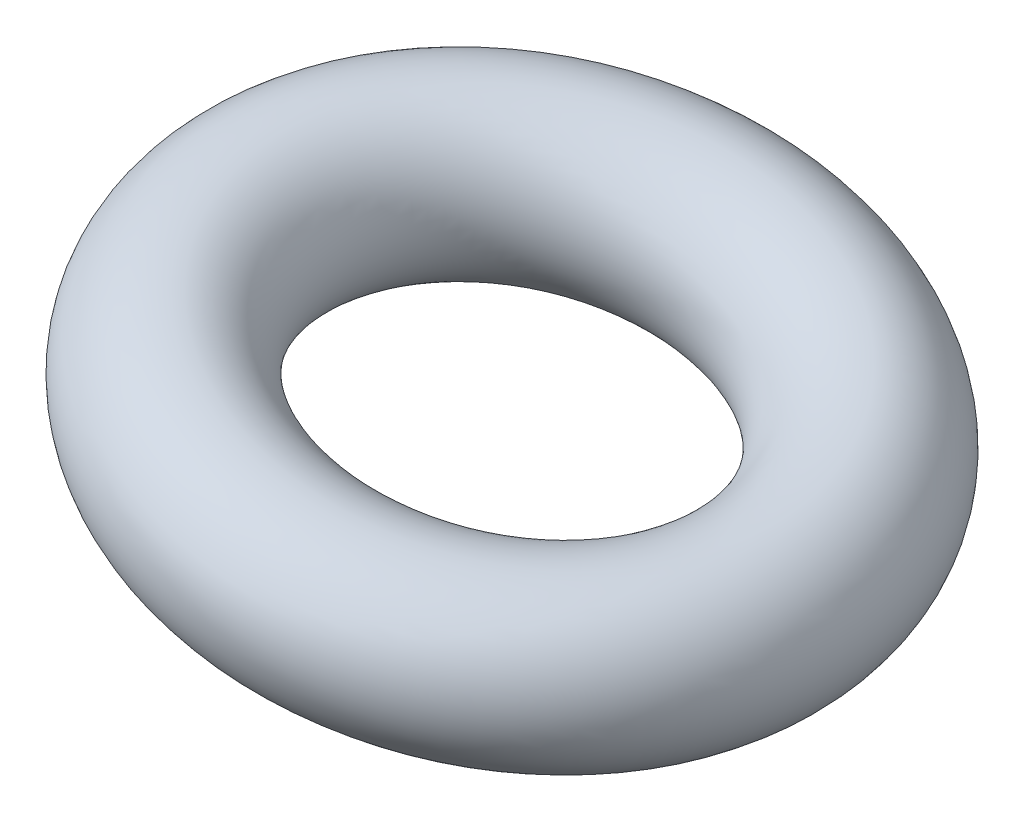
ISO-10303-21;
HEADER;
FILE_DESCRIPTION(('STEP AP214'),'2;1');
FILE_NAME('part.step','',(''),(''),'','','');
FILE_SCHEMA(('AUTOMOTIVE_DESIGN { 1 0 10303 214 1 1 1 1 }'));
ENDSEC;
DATA;
#1=APPLICATION_CONTEXT('core data for automotive mechanical design processes');
#2=APPLICATION_PROTOCOL_DEFINITION('international standard','automotive_design',2000,#1);
#3=PRODUCT_CONTEXT('',#1,'mechanical');
#4=PRODUCT('Part','Part','',(#3));
#5=PRODUCT_RELATED_PRODUCT_CATEGORY('part','',(#4));
#6=PRODUCT_DEFINITION_FORMATION('','',#4);
#7=PRODUCT_DEFINITION_CONTEXT('part definition',#1,'design');
#8=PRODUCT_DEFINITION('design','',#6,#7);
#9=PRODUCT_DEFINITION_SHAPE('','',#8);
#10=(LENGTH_UNIT() NAMED_UNIT(*) SI_UNIT(.MILLI.,.METRE.));
#11=(NAMED_UNIT(*) PLANE_ANGLE_UNIT() SI_UNIT($,.RADIAN.));
#12=(NAMED_UNIT(*) SI_UNIT($,.STERADIAN.) SOLID_ANGLE_UNIT());
#13=UNCERTAINTY_MEASURE_WITH_UNIT(LENGTH_MEASURE(1.E-05),#10,'distance_accuracy_value','');
#14=(GEOMETRIC_REPRESENTATION_CONTEXT(3) GLOBAL_UNCERTAINTY_ASSIGNED_CONTEXT((#13)) GLOBAL_UNIT_ASSIGNED_CONTEXT((#10,
#11,#12)) REPRESENTATION_CONTEXT('',''));
#15=CARTESIAN_POINT('',(0.,0.,0.));
#16=DIRECTION('',(0.,0.,1.));
#17=DIRECTION('',(1.,0.,0.));
#18=AXIS2_PLACEMENT_3D('',#15,#16,#17);
#19=CARTESIAN_POINT('',(-17.7375362304439,0.9048971820028,0.));
#20=DIRECTION('',(-0.207911690817813,-0.978147600733794,0.));
#21=DIRECTION('',(0.978147600733794,-0.207911690817813,0.));
#22=AXIS2_PLACEMENT_3D('',#19,#20,#21);
#23=TOROIDAL_SURFACE('',#22,3.00000000000006,0.999999999999991);
#24=CARTESIAN_POINT('',(-13.8249458275086,0.0732504187315385,0.));
#25=VERTEX_POINT('',#24);
#26=VERTEX_LOOP('',#25);
#27=FACE_BOUND('',#26,.T.);
#28=ADVANCED_FACE('F39',(#27),#23,.T.);
#29=CLOSED_SHELL('',(#28));
#30=MANIFOLD_SOLID_BREP('B2',#29);
#31=ADVANCED_BREP_SHAPE_REPRESENTATION('',(#18,#30),#14);
#32=SHAPE_DEFINITION_REPRESENTATION(#9,#31);
ENDSEC;
END-ISO-10303-21;
